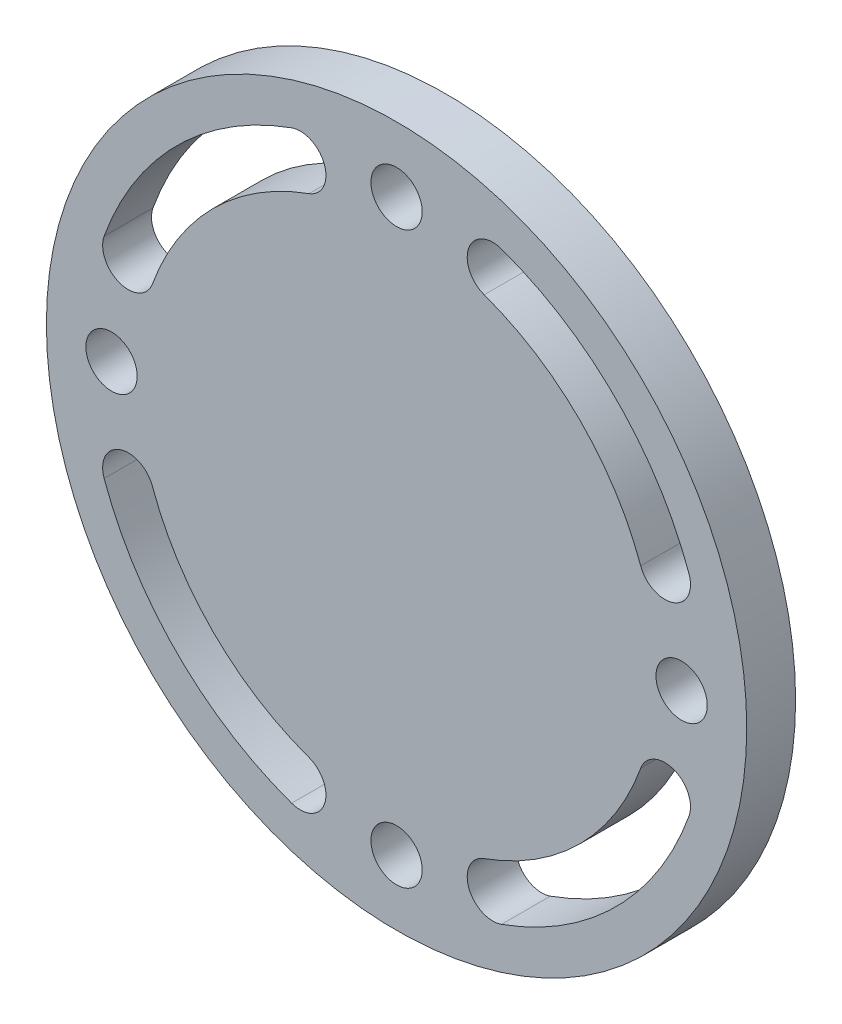
ISO-10303-21;
HEADER;
FILE_DESCRIPTION(('STEP AP214'),'2;1');
FILE_NAME('part.step','',(''),(''),'','','');
FILE_SCHEMA(('AUTOMOTIVE_DESIGN { 1 0 10303 214 1 1 1 1 }'));
ENDSEC;
DATA;
#1=APPLICATION_CONTEXT('core data for automotive mechanical design processes');
#2=APPLICATION_PROTOCOL_DEFINITION('international standard','automotive_design',2000,#1);
#3=PRODUCT_CONTEXT('',#1,'mechanical');
#4=PRODUCT('Part','Part','',(#3));
#5=PRODUCT_RELATED_PRODUCT_CATEGORY('part','',(#4));
#6=PRODUCT_DEFINITION_FORMATION('','',#4);
#7=PRODUCT_DEFINITION_CONTEXT('part definition',#1,'design');
#8=PRODUCT_DEFINITION('design','',#6,#7);
#9=PRODUCT_DEFINITION_SHAPE('','',#8);
#10=(LENGTH_UNIT() NAMED_UNIT(*) SI_UNIT(.MILLI.,.METRE.));
#11=(NAMED_UNIT(*) PLANE_ANGLE_UNIT() SI_UNIT($,.RADIAN.));
#12=(NAMED_UNIT(*) SI_UNIT($,.STERADIAN.) SOLID_ANGLE_UNIT());
#13=UNCERTAINTY_MEASURE_WITH_UNIT(LENGTH_MEASURE(1.E-05),#10,'distance_accuracy_value','');
#14=(GEOMETRIC_REPRESENTATION_CONTEXT(3) GLOBAL_UNCERTAINTY_ASSIGNED_CONTEXT((#13)) GLOBAL_UNIT_ASSIGNED_CONTEXT((#10,
#11,#12)) REPRESENTATION_CONTEXT('',''));
#15=CARTESIAN_POINT('',(0.,0.,0.));
#16=DIRECTION('',(0.,0.,1.));
#17=DIRECTION('',(1.,0.,0.));
#18=AXIS2_PLACEMENT_3D('',#15,#16,#17);
#19=CARTESIAN_POINT('',(0.,0.,3.));
#20=DIRECTION('',(0.,0.,1.));
#21=DIRECTION('',(1.,0.,0.));
#22=AXIS2_PLACEMENT_3D('',#19,#20,#21);
#23=PLANE('',#22);
#24=CARTESIAN_POINT('',(0.,-17.5,3.));
#25=DIRECTION('',(0.,0.,1.));
#26=DIRECTION('',(1.,0.,0.));
#27=AXIS2_PLACEMENT_3D('',#24,#25,#26);
#28=CIRCLE('',#27,1.575);
#29=CARTESIAN_POINT('',(1.57500000000001,-17.5,3.));
#30=VERTEX_POINT('',#29);
#31=EDGE_CURVE('E295',#30,#30,#28,.T.);
#32=ORIENTED_EDGE('',*,*,#31,.F.);
#33=EDGE_LOOP('',(#32));
#34=FACE_BOUND('',#33,.T.);
#35=CARTESIAN_POINT('',(-16.4714285714286,5.91117930842286,3.));
#36=DIRECTION('',(0.,0.,1.));
#37=DIRECTION('',(1.,0.,0.));
#38=AXIS2_PLACEMENT_3D('',#35,#36,#37);
#39=CIRCLE('',#38,1.575);
#40=CARTESIAN_POINT('',(-17.9538571428571,6.44318544618091,3.));
#41=VERTEX_POINT('',#40);
#42=CARTESIAN_POINT('',(-14.989,5.3791731706648,3.));
#43=VERTEX_POINT('',#42);
#44=EDGE_CURVE('E314',#41,#43,#39,.T.);
#45=ORIENTED_EDGE('',*,*,#44,.F.);
#46=CARTESIAN_POINT('',(0.,0.,3.));
#47=DIRECTION('',(0.,0.,1.));
#48=DIRECTION('',(1.,0.,0.));
#49=AXIS2_PLACEMENT_3D('',#46,#47,#48);
#50=CIRCLE('',#49,19.075);
#51=CARTESIAN_POINT('',(-6.44318544618092,17.9538571428571,3.));
#52=VERTEX_POINT('',#51);
#53=EDGE_CURVE('E311',#52,#41,#50,.T.);
#54=ORIENTED_EDGE('',*,*,#53,.F.);
#55=CARTESIAN_POINT('',(-5.91117930842286,16.4714285714286,3.));
#56=DIRECTION('',(0.,0.,1.));
#57=DIRECTION('',(1.,0.,0.));
#58=AXIS2_PLACEMENT_3D('',#55,#56,#57);
#59=CIRCLE('',#58,1.57500000000001);
#60=CARTESIAN_POINT('',(-5.3791731706648,14.989,3.));
#61=VERTEX_POINT('',#60);
#62=EDGE_CURVE('E322',#61,#52,#59,.T.);
#63=ORIENTED_EDGE('',*,*,#62,.F.);
#64=CARTESIAN_POINT('',(0.,0.,3.));
#65=DIRECTION('',(0.,0.,-1.));
#66=DIRECTION('',(1.,0.,0.));
#67=AXIS2_PLACEMENT_3D('',#64,#65,#66);
#68=CIRCLE('',#67,15.925);
#69=EDGE_CURVE('E318',#43,#61,#68,.T.);
#70=ORIENTED_EDGE('',*,*,#69,.F.);
#71=EDGE_LOOP('',(#45,#54,#63,#70));
#72=FACE_BOUND('',#71,.T.);
#73=CARTESIAN_POINT('',(0.,17.5,3.));
#74=DIRECTION('',(0.,0.,1.));
#75=DIRECTION('',(1.,0.,0.));
#76=AXIS2_PLACEMENT_3D('',#73,#74,#75);
#77=CIRCLE('',#76,1.575);
#78=CARTESIAN_POINT('',(1.575,17.5,3.));
#79=VERTEX_POINT('',#78);
#80=EDGE_CURVE('E354',#79,#79,#77,.T.);
#81=ORIENTED_EDGE('',*,*,#80,.F.);
#82=EDGE_LOOP('',(#81));
#83=FACE_BOUND('',#82,.T.);
#84=CARTESIAN_POINT('',(0.,0.,3.));
#85=DIRECTION('',(0.,0.,1.));
#86=DIRECTION('',(1.,0.,0.));
#87=AXIS2_PLACEMENT_3D('',#84,#85,#86);
#88=CIRCLE('',#87,21.5);
#89=CARTESIAN_POINT('',(21.5,0.,3.));
#90=VERTEX_POINT('',#89);
#91=EDGE_CURVE('E11',#90,#90,#88,.T.);
#92=ORIENTED_EDGE('',*,*,#91,.T.);
#93=EDGE_LOOP('',(#92));
#94=FACE_BOUND('',#93,.T.);
#95=CARTESIAN_POINT('',(17.5,0.,3.));
#96=DIRECTION('',(0.,0.,1.));
#97=DIRECTION('',(1.,0.,0.));
#98=AXIS2_PLACEMENT_3D('',#95,#96,#97);
#99=CIRCLE('',#98,1.575);
#100=CARTESIAN_POINT('',(19.075,0.,3.));
#101=VERTEX_POINT('',#100);
#102=EDGE_CURVE('E303',#101,#101,#99,.T.);
#103=ORIENTED_EDGE('',*,*,#102,.F.);
#104=EDGE_LOOP('',(#103));
#105=FACE_BOUND('',#104,.T.);
#106=CARTESIAN_POINT('',(-17.5,0.,3.));
#107=DIRECTION('',(0.,0.,1.));
#108=DIRECTION('',(1.,0.,0.));
#109=AXIS2_PLACEMENT_3D('',#106,#107,#108);
#110=CIRCLE('',#109,1.575);
#111=CARTESIAN_POINT('',(-15.925,0.,3.));
#112=VERTEX_POINT('',#111);
#113=EDGE_CURVE('E287',#112,#112,#110,.T.);
#114=ORIENTED_EDGE('',*,*,#113,.F.);
#115=EDGE_LOOP('',(#114));
#116=FACE_BOUND('',#115,.T.);
#117=CARTESIAN_POINT('',(0.,0.,3.));
#118=DIRECTION('',(0.,0.,-1.));
#119=DIRECTION('',(-1.,0.,0.));
#120=AXIS2_PLACEMENT_3D('',#117,#118,#119);
#121=CIRCLE('',#120,15.925);
#122=CARTESIAN_POINT('',(5.3791731706648,14.989,3.));
#123=VERTEX_POINT('',#122);
#124=CARTESIAN_POINT('',(14.989,5.3791731706648,3.));
#125=VERTEX_POINT('',#124);
#126=EDGE_CURVE('E247',#123,#125,#121,.T.);
#127=ORIENTED_EDGE('',*,*,#126,.F.);
#128=CARTESIAN_POINT('',(5.91117930842286,16.4714285714286,3.));
#129=DIRECTION('',(0.,0.,1.));
#130=DIRECTION('',(-1.,0.,0.));
#131=AXIS2_PLACEMENT_3D('',#128,#129,#130);
#132=CIRCLE('',#131,1.57500000000001);
#133=CARTESIAN_POINT('',(6.44318544618091,17.9538571428571,3.));
#134=VERTEX_POINT('',#133);
#135=EDGE_CURVE('E244',#134,#123,#132,.T.);
#136=ORIENTED_EDGE('',*,*,#135,.F.);
#137=CARTESIAN_POINT('',(0.,0.,3.));
#138=DIRECTION('',(0.,0.,1.));
#139=DIRECTION('',(-1.,0.,0.));
#140=AXIS2_PLACEMENT_3D('',#137,#138,#139);
#141=CIRCLE('',#140,19.075);
#142=CARTESIAN_POINT('',(17.9538571428571,6.44318544618092,3.));
#143=VERTEX_POINT('',#142);
#144=EDGE_CURVE('E255',#143,#134,#141,.T.);
#145=ORIENTED_EDGE('',*,*,#144,.F.);
#146=CARTESIAN_POINT('',(16.4714285714286,5.91117930842286,3.));
#147=DIRECTION('',(0.,0.,1.));
#148=DIRECTION('',(-1.,0.,0.));
#149=AXIS2_PLACEMENT_3D('',#146,#147,#148);
#150=CIRCLE('',#149,1.575);
#151=EDGE_CURVE('E251',#125,#143,#150,.T.);
#152=ORIENTED_EDGE('',*,*,#151,.F.);
#153=EDGE_LOOP('',(#127,#136,#145,#152));
#154=FACE_BOUND('',#153,.T.);
#155=CARTESIAN_POINT('',(5.91117930842286,-16.4714285714286,3.));
#156=DIRECTION('',(0.,0.,1.));
#157=DIRECTION('',(1.,0.,0.));
#158=AXIS2_PLACEMENT_3D('',#155,#156,#157);
#159=CIRCLE('',#158,1.57500000000001);
#160=CARTESIAN_POINT('',(5.3791731706648,-14.989,3.));
#161=VERTEX_POINT('',#160);
#162=CARTESIAN_POINT('',(6.44318544618092,-17.9538571428571,3.));
#163=VERTEX_POINT('',#162);
#164=EDGE_CURVE('E204',#161,#163,#159,.T.);
#165=ORIENTED_EDGE('',*,*,#164,.F.);
#166=CARTESIAN_POINT('',(0.,0.,3.));
#167=DIRECTION('',(0.,0.,-1.));
#168=DIRECTION('',(1.,0.,0.));
#169=AXIS2_PLACEMENT_3D('',#166,#167,#168);
#170=CIRCLE('',#169,15.925);
#171=CARTESIAN_POINT('',(14.989,-5.3791731706648,3.));
#172=VERTEX_POINT('',#171);
#173=EDGE_CURVE('E201',#172,#161,#170,.T.);
#174=ORIENTED_EDGE('',*,*,#173,.F.);
#175=CARTESIAN_POINT('',(16.4714285714286,-5.91117930842286,3.));
#176=DIRECTION('',(0.,0.,1.));
#177=DIRECTION('',(1.,0.,0.));
#178=AXIS2_PLACEMENT_3D('',#175,#176,#177);
#179=CIRCLE('',#178,1.575);
#180=CARTESIAN_POINT('',(17.9538571428571,-6.44318544618092,3.));
#181=VERTEX_POINT('',#180);
#182=EDGE_CURVE('E212',#181,#172,#179,.T.);
#183=ORIENTED_EDGE('',*,*,#182,.F.);
#184=CARTESIAN_POINT('',(0.,0.,3.));
#185=DIRECTION('',(0.,0.,1.));
#186=DIRECTION('',(1.,0.,0.));
#187=AXIS2_PLACEMENT_3D('',#184,#185,#186);
#188=CIRCLE('',#187,19.075);
#189=EDGE_CURVE('E208',#163,#181,#188,.T.);
#190=ORIENTED_EDGE('',*,*,#189,.F.);
#191=EDGE_LOOP('',(#165,#174,#183,#190));
#192=FACE_BOUND('',#191,.T.);
#193=CARTESIAN_POINT('',(0.,0.,3.));
#194=DIRECTION('',(0.,0.,-1.));
#195=DIRECTION('',(-1.,0.,0.));
#196=AXIS2_PLACEMENT_3D('',#193,#194,#195);
#197=CIRCLE('',#196,15.925);
#198=CARTESIAN_POINT('',(-5.3791731706648,-14.989,3.));
#199=VERTEX_POINT('',#198);
#200=CARTESIAN_POINT('',(-14.989,-5.3791731706648,3.));
#201=VERTEX_POINT('',#200);
#202=EDGE_CURVE('E162',#199,#201,#197,.T.);
#203=ORIENTED_EDGE('',*,*,#202,.F.);
#204=CARTESIAN_POINT('',(-5.91117930842286,-16.4714285714286,3.));
#205=DIRECTION('',(0.,0.,1.));
#206=DIRECTION('',(-1.,0.,0.));
#207=AXIS2_PLACEMENT_3D('',#204,#205,#206);
#208=CIRCLE('',#207,1.57500000000001);
#209=CARTESIAN_POINT('',(-6.44318544618092,-17.9538571428571,3.));
#210=VERTEX_POINT('',#209);
#211=EDGE_CURVE('E153',#210,#199,#208,.T.);
#212=ORIENTED_EDGE('',*,*,#211,.F.);
#213=CARTESIAN_POINT('',(0.,0.,3.));
#214=DIRECTION('',(0.,0.,1.));
#215=DIRECTION('',(-1.,0.,0.));
#216=AXIS2_PLACEMENT_3D('',#213,#214,#215);
#217=CIRCLE('',#216,19.075);
#218=CARTESIAN_POINT('',(-17.9538571428571,-6.44318544618092,3.));
#219=VERTEX_POINT('',#218);
#220=EDGE_CURVE('E179',#219,#210,#217,.T.);
#221=ORIENTED_EDGE('',*,*,#220,.F.);
#222=CARTESIAN_POINT('',(-16.4714285714286,-5.91117930842286,3.));
#223=DIRECTION('',(0.,0.,1.));
#224=DIRECTION('',(-1.,0.,0.));
#225=AXIS2_PLACEMENT_3D('',#222,#223,#224);
#226=CIRCLE('',#225,1.575);
#227=EDGE_CURVE('E175',#201,#219,#226,.T.);
#228=ORIENTED_EDGE('',*,*,#227,.F.);
#229=EDGE_LOOP('',(#203,#212,#221,#228));
#230=FACE_BOUND('',#229,.T.);
#231=ADVANCED_FACE('F39',(#34,#72,#83,#94,#105,#116,#154,#192,#230),#23,.T.);
#232=CARTESIAN_POINT('',(0.,0.,0.));
#233=DIRECTION('',(0.,0.,1.));
#234=DIRECTION('',(1.,0.,0.));
#235=AXIS2_PLACEMENT_3D('',#232,#233,#234);
#236=PLANE('',#235);
#237=CARTESIAN_POINT('',(0.,0.,0.));
#238=DIRECTION('',(0.,0.,-1.));
#239=DIRECTION('',(1.,0.,0.));
#240=AXIS2_PLACEMENT_3D('',#237,#238,#239);
#241=CIRCLE('',#240,15.925);
#242=CARTESIAN_POINT('',(14.989,-5.3791731706648,0.));
#243=VERTEX_POINT('',#242);
#244=CARTESIAN_POINT('',(5.3791731706648,-14.989,0.));
#245=VERTEX_POINT('',#244);
#246=EDGE_CURVE('E171',#243,#245,#241,.T.);
#247=ORIENTED_EDGE('',*,*,#246,.T.);
#248=CARTESIAN_POINT('',(5.91117930842286,-16.4714285714286,0.));
#249=DIRECTION('',(0.,0.,1.));
#250=DIRECTION('',(1.,0.,0.));
#251=AXIS2_PLACEMENT_3D('',#248,#249,#250);
#252=CIRCLE('',#251,1.57500000000001);
#253=CARTESIAN_POINT('',(6.44318544618092,-17.9538571428571,0.));
#254=VERTEX_POINT('',#253);
#255=EDGE_CURVE('E219',#245,#254,#252,.T.);
#256=ORIENTED_EDGE('',*,*,#255,.T.);
#257=CARTESIAN_POINT('',(0.,0.,0.));
#258=DIRECTION('',(0.,0.,1.));
#259=DIRECTION('',(1.,0.,0.));
#260=AXIS2_PLACEMENT_3D('',#257,#258,#259);
#261=CIRCLE('',#260,19.075);
#262=CARTESIAN_POINT('',(17.9538571428571,-6.44318544618092,0.));
#263=VERTEX_POINT('',#262);
#264=EDGE_CURVE('E223',#254,#263,#261,.T.);
#265=ORIENTED_EDGE('',*,*,#264,.T.);
#266=CARTESIAN_POINT('',(16.4714285714286,-5.91117930842286,0.));
#267=DIRECTION('',(0.,0.,1.));
#268=DIRECTION('',(1.,0.,0.));
#269=AXIS2_PLACEMENT_3D('',#266,#267,#268);
#270=CIRCLE('',#269,1.575);
#271=EDGE_CURVE('E205',#263,#243,#270,.T.);
#272=ORIENTED_EDGE('',*,*,#271,.T.);
#273=EDGE_LOOP('',(#247,#256,#265,#272));
#274=FACE_BOUND('',#273,.T.);
#275=CARTESIAN_POINT('',(-17.5,0.,0.));
#276=DIRECTION('',(0.,0.,1.));
#277=DIRECTION('',(1.,0.,0.));
#278=AXIS2_PLACEMENT_3D('',#275,#276,#277);
#279=CIRCLE('',#278,1.575);
#280=CARTESIAN_POINT('',(-15.925,0.,0.));
#281=VERTEX_POINT('',#280);
#282=EDGE_CURVE('E286',#281,#281,#279,.T.);
#283=ORIENTED_EDGE('',*,*,#282,.T.);
#284=EDGE_LOOP('',(#283));
#285=FACE_BOUND('',#284,.T.);
#286=CARTESIAN_POINT('',(0.,-17.5,0.));
#287=DIRECTION('',(0.,0.,1.));
#288=DIRECTION('',(1.,0.,0.));
#289=AXIS2_PLACEMENT_3D('',#286,#287,#288);
#290=CIRCLE('',#289,1.575);
#291=CARTESIAN_POINT('',(1.57500000000001,-17.5,0.));
#292=VERTEX_POINT('',#291);
#293=EDGE_CURVE('E291',#292,#292,#290,.T.);
#294=ORIENTED_EDGE('',*,*,#293,.T.);
#295=EDGE_LOOP('',(#294));
#296=FACE_BOUND('',#295,.T.);
#297=CARTESIAN_POINT('',(17.5,0.,0.));
#298=DIRECTION('',(0.,0.,1.));
#299=DIRECTION('',(1.,0.,0.));
#300=AXIS2_PLACEMENT_3D('',#297,#298,#299);
#301=CIRCLE('',#300,1.575);
#302=CARTESIAN_POINT('',(19.075,0.,0.));
#303=VERTEX_POINT('',#302);
#304=EDGE_CURVE('E299',#303,#303,#301,.T.);
#305=ORIENTED_EDGE('',*,*,#304,.T.);
#306=EDGE_LOOP('',(#305));
#307=FACE_BOUND('',#306,.T.);
#308=CARTESIAN_POINT('',(0.,0.,0.));
#309=DIRECTION('',(0.,0.,1.));
#310=DIRECTION('',(1.,0.,0.));
#311=AXIS2_PLACEMENT_3D('',#308,#309,#310);
#312=CIRCLE('',#311,19.075);
#313=CARTESIAN_POINT('',(-6.44318544618092,17.9538571428571,0.));
#314=VERTEX_POINT('',#313);
#315=CARTESIAN_POINT('',(-17.9538571428571,6.44318544618091,0.));
#316=VERTEX_POINT('',#315);
#317=EDGE_CURVE('E307',#314,#316,#312,.T.);
#318=ORIENTED_EDGE('',*,*,#317,.T.);
#319=CARTESIAN_POINT('',(-16.4714285714286,5.91117930842286,0.));
#320=DIRECTION('',(0.,0.,1.));
#321=DIRECTION('',(1.,0.,0.));
#322=AXIS2_PLACEMENT_3D('',#319,#320,#321);
#323=CIRCLE('',#322,1.575);
#324=CARTESIAN_POINT('',(-14.989,5.3791731706648,0.));
#325=VERTEX_POINT('',#324);
#326=EDGE_CURVE('E329',#316,#325,#323,.T.);
#327=ORIENTED_EDGE('',*,*,#326,.T.);
#328=CARTESIAN_POINT('',(0.,0.,0.));
#329=DIRECTION('',(0.,0.,-1.));
#330=DIRECTION('',(1.,0.,0.));
#331=AXIS2_PLACEMENT_3D('',#328,#329,#330);
#332=CIRCLE('',#331,15.925);
#333=CARTESIAN_POINT('',(-5.3791731706648,14.989,0.));
#334=VERTEX_POINT('',#333);
#335=EDGE_CURVE('E333',#325,#334,#332,.T.);
#336=ORIENTED_EDGE('',*,*,#335,.T.);
#337=CARTESIAN_POINT('',(-5.91117930842286,16.4714285714286,0.));
#338=DIRECTION('',(0.,0.,1.));
#339=DIRECTION('',(1.,0.,0.));
#340=AXIS2_PLACEMENT_3D('',#337,#338,#339);
#341=CIRCLE('',#340,1.57500000000001);
#342=EDGE_CURVE('E315',#334,#314,#341,.T.);
#343=ORIENTED_EDGE('',*,*,#342,.T.);
#344=EDGE_LOOP('',(#318,#327,#336,#343));
#345=FACE_BOUND('',#344,.T.);
#346=CARTESIAN_POINT('',(0.,0.,0.));
#347=DIRECTION('',(0.,0.,1.));
#348=DIRECTION('',(1.,0.,0.));
#349=AXIS2_PLACEMENT_3D('',#346,#347,#348);
#350=CIRCLE('',#349,21.5);
#351=CARTESIAN_POINT('',(21.5,0.,0.));
#352=VERTEX_POINT('',#351);
#353=EDGE_CURVE('E43',#352,#352,#350,.T.);
#354=ORIENTED_EDGE('',*,*,#353,.F.);
#355=EDGE_LOOP('',(#354));
#356=FACE_BOUND('',#355,.T.);
#357=CARTESIAN_POINT('',(0.,17.5,0.));
#358=DIRECTION('',(0.,0.,1.));
#359=DIRECTION('',(1.,0.,0.));
#360=AXIS2_PLACEMENT_3D('',#357,#358,#359);
#361=CIRCLE('',#360,1.575);
#362=CARTESIAN_POINT('',(1.575,17.5,0.));
#363=VERTEX_POINT('',#362);
#364=EDGE_CURVE('E353',#363,#363,#361,.T.);
#365=ORIENTED_EDGE('',*,*,#364,.T.);
#366=EDGE_LOOP('',(#365));
#367=FACE_BOUND('',#366,.T.);
#368=CARTESIAN_POINT('',(5.91117930842286,16.4714285714286,0.));
#369=DIRECTION('',(0.,0.,1.));
#370=DIRECTION('',(-1.,0.,0.));
#371=AXIS2_PLACEMENT_3D('',#368,#369,#370);
#372=CIRCLE('',#371,1.57500000000001);
#373=CARTESIAN_POINT('',(6.44318544618091,17.9538571428571,0.));
#374=VERTEX_POINT('',#373);
#375=CARTESIAN_POINT('',(5.3791731706648,14.989,0.));
#376=VERTEX_POINT('',#375);
#377=EDGE_CURVE('E243',#374,#376,#372,.T.);
#378=ORIENTED_EDGE('',*,*,#377,.T.);
#379=CARTESIAN_POINT('',(0.,0.,0.));
#380=DIRECTION('',(0.,0.,-1.));
#381=DIRECTION('',(-1.,0.,0.));
#382=AXIS2_PLACEMENT_3D('',#379,#380,#381);
#383=CIRCLE('',#382,15.925);
#384=CARTESIAN_POINT('',(14.989,5.3791731706648,0.));
#385=VERTEX_POINT('',#384);
#386=EDGE_CURVE('E262',#376,#385,#383,.T.);
#387=ORIENTED_EDGE('',*,*,#386,.T.);
#388=CARTESIAN_POINT('',(16.4714285714286,5.91117930842286,0.));
#389=DIRECTION('',(0.,0.,1.));
#390=DIRECTION('',(-1.,0.,0.));
#391=AXIS2_PLACEMENT_3D('',#388,#389,#390);
#392=CIRCLE('',#391,1.575);
#393=CARTESIAN_POINT('',(17.9538571428571,6.44318544618091,0.));
#394=VERTEX_POINT('',#393);
#395=EDGE_CURVE('E266',#385,#394,#392,.T.);
#396=ORIENTED_EDGE('',*,*,#395,.T.);
#397=CARTESIAN_POINT('',(0.,0.,0.));
#398=DIRECTION('',(0.,0.,1.));
#399=DIRECTION('',(-1.,0.,0.));
#400=AXIS2_PLACEMENT_3D('',#397,#398,#399);
#401=CIRCLE('',#400,19.075);
#402=EDGE_CURVE('E248',#394,#374,#401,.T.);
#403=ORIENTED_EDGE('',*,*,#402,.T.);
#404=EDGE_LOOP('',(#378,#387,#396,#403));
#405=FACE_BOUND('',#404,.T.);
#406=CARTESIAN_POINT('',(-5.91117930842286,-16.4714285714286,0.));
#407=DIRECTION('',(0.,0.,1.));
#408=DIRECTION('',(-1.,0.,0.));
#409=AXIS2_PLACEMENT_3D('',#406,#407,#408);
#410=CIRCLE('',#409,1.57500000000001);
#411=CARTESIAN_POINT('',(-6.44318544618092,-17.9538571428571,0.));
#412=VERTEX_POINT('',#411);
#413=CARTESIAN_POINT('',(-5.3791731706648,-14.989,0.));
#414=VERTEX_POINT('',#413);
#415=EDGE_CURVE('E63',#412,#414,#410,.T.);
#416=ORIENTED_EDGE('',*,*,#415,.T.);
#417=CARTESIAN_POINT('',(0.,0.,0.));
#418=DIRECTION('',(0.,0.,-1.));
#419=DIRECTION('',(-1.,0.,0.));
#420=AXIS2_PLACEMENT_3D('',#417,#418,#419);
#421=CIRCLE('',#420,15.925);
#422=CARTESIAN_POINT('',(-14.989,-5.3791731706648,0.));
#423=VERTEX_POINT('',#422);
#424=EDGE_CURVE('E169',#414,#423,#421,.T.);
#425=ORIENTED_EDGE('',*,*,#424,.T.);
#426=CARTESIAN_POINT('',(-16.4714285714286,-5.91117930842286,0.));
#427=DIRECTION('',(0.,0.,1.));
#428=DIRECTION('',(-1.,0.,0.));
#429=AXIS2_PLACEMENT_3D('',#426,#427,#428);
#430=CIRCLE('',#429,1.575);
#431=CARTESIAN_POINT('',(-17.9538571428571,-6.44318544618091,0.));
#432=VERTEX_POINT('',#431);
#433=EDGE_CURVE('E188',#423,#432,#430,.T.);
#434=ORIENTED_EDGE('',*,*,#433,.T.);
#435=CARTESIAN_POINT('',(0.,0.,0.));
#436=DIRECTION('',(0.,0.,1.));
#437=DIRECTION('',(-1.,0.,0.));
#438=AXIS2_PLACEMENT_3D('',#435,#436,#437);
#439=CIRCLE('',#438,19.075);
#440=EDGE_CURVE('E163',#432,#412,#439,.T.);
#441=ORIENTED_EDGE('',*,*,#440,.T.);
#442=EDGE_LOOP('',(#416,#425,#434,#441));
#443=FACE_BOUND('',#442,.T.);
#444=ADVANCED_FACE('F362',(#274,#285,#296,#307,#345,#356,#367,#405,#443),#236,.F.);
#445=CARTESIAN_POINT('',(0.,0.,3.));
#446=DIRECTION('',(0.,0.,-1.));
#447=DIRECTION('',(-1.,0.,0.));
#448=AXIS2_PLACEMENT_3D('',#445,#446,#447);
#449=CYLINDRICAL_SURFACE('',#448,21.5);
#450=ORIENTED_EDGE('',*,*,#91,.F.);
#451=EDGE_LOOP('',(#450));
#452=FACE_BOUND('',#451,.T.);
#453=ORIENTED_EDGE('',*,*,#353,.T.);
#454=EDGE_LOOP('',(#453));
#455=FACE_BOUND('',#454,.T.);
#456=ADVANCED_FACE('F41',(#452,#455),#449,.T.);
#457=CARTESIAN_POINT('',(0.,17.5,3.));
#458=DIRECTION('',(0.,0.,-1.));
#459=DIRECTION('',(-1.,0.,0.));
#460=AXIS2_PLACEMENT_3D('',#457,#458,#459);
#461=CYLINDRICAL_SURFACE('',#460,1.575);
#462=ORIENTED_EDGE('',*,*,#80,.T.);
#463=EDGE_LOOP('',(#462));
#464=FACE_BOUND('',#463,.T.);
#465=ORIENTED_EDGE('',*,*,#364,.F.);
#466=EDGE_LOOP('',(#465));
#467=FACE_BOUND('',#466,.T.);
#468=ADVANCED_FACE('F365',(#464,#467),#461,.F.);
#469=CARTESIAN_POINT('',(0.,0.,3.));
#470=DIRECTION('',(0.,0.,-1.));
#471=DIRECTION('',(-1.,0.,0.));
#472=AXIS2_PLACEMENT_3D('',#469,#470,#471);
#473=CYLINDRICAL_SURFACE('',#472,19.075);
#474=ORIENTED_EDGE('',*,*,#317,.F.);
#475=DIRECTION('',(0.,0.,-1.));
#476=VECTOR('',#475,1.);
#477=CARTESIAN_POINT('',(-6.44318544618092,17.9538571428571,3.));
#478=LINE('',#477,#476);
#479=EDGE_CURVE('E325',#52,#314,#478,.T.);
#480=ORIENTED_EDGE('',*,*,#479,.F.);
#481=ORIENTED_EDGE('',*,*,#53,.T.);
#482=DIRECTION('',(0.,0.,-1.));
#483=VECTOR('',#482,1.);
#484=CARTESIAN_POINT('',(-17.9538571428571,6.44318544618091,3.));
#485=LINE('',#484,#483);
#486=EDGE_CURVE('E349',#41,#316,#485,.T.);
#487=ORIENTED_EDGE('',*,*,#486,.T.);
#488=EDGE_LOOP('',(#474,#480,#481,#487));
#489=FACE_BOUND('',#488,.T.);
#490=ADVANCED_FACE('F367',(#489),#473,.F.);
#491=CARTESIAN_POINT('',(-16.4714285714286,5.91117930842286,3.));
#492=DIRECTION('',(0.,0.,-1.));
#493=DIRECTION('',(-1.,0.,0.));
#494=AXIS2_PLACEMENT_3D('',#491,#492,#493);
#495=CYLINDRICAL_SURFACE('',#494,1.575);
#496=ORIENTED_EDGE('',*,*,#326,.F.);
#497=ORIENTED_EDGE('',*,*,#486,.F.);
#498=ORIENTED_EDGE('',*,*,#44,.T.);
#499=DIRECTION('',(0.,0.,-1.));
#500=VECTOR('',#499,1.);
#501=CARTESIAN_POINT('',(-14.989,5.3791731706648,3.));
#502=LINE('',#501,#500);
#503=EDGE_CURVE('E346',#43,#325,#502,.T.);
#504=ORIENTED_EDGE('',*,*,#503,.T.);
#505=EDGE_LOOP('',(#496,#497,#498,#504));
#506=FACE_BOUND('',#505,.T.);
#507=ADVANCED_FACE('F374',(#506),#495,.F.);
#508=CARTESIAN_POINT('',(0.,0.,3.));
#509=DIRECTION('',(0.,0.,-1.));
#510=DIRECTION('',(-1.,0.,0.));
#511=AXIS2_PLACEMENT_3D('',#508,#509,#510);
#512=CYLINDRICAL_SURFACE('',#511,15.925);
#513=ORIENTED_EDGE('',*,*,#335,.F.);
#514=ORIENTED_EDGE('',*,*,#503,.F.);
#515=ORIENTED_EDGE('',*,*,#69,.T.);
#516=DIRECTION('',(0.,0.,-1.));
#517=VECTOR('',#516,1.);
#518=CARTESIAN_POINT('',(-5.3791731706648,14.989,3.));
#519=LINE('',#518,#517);
#520=EDGE_CURVE('E343',#61,#334,#519,.T.);
#521=ORIENTED_EDGE('',*,*,#520,.T.);
#522=EDGE_LOOP('',(#513,#514,#515,#521));
#523=FACE_BOUND('',#522,.T.);
#524=ADVANCED_FACE('F466',(#523),#512,.T.);
#525=CARTESIAN_POINT('',(-5.91117930842286,16.4714285714286,3.));
#526=DIRECTION('',(0.,0.,-1.));
#527=DIRECTION('',(-1.,0.,0.));
#528=AXIS2_PLACEMENT_3D('',#525,#526,#527);
#529=CYLINDRICAL_SURFACE('',#528,1.57500000000001);
#530=ORIENTED_EDGE('',*,*,#342,.F.);
#531=ORIENTED_EDGE('',*,*,#520,.F.);
#532=ORIENTED_EDGE('',*,*,#62,.T.);
#533=ORIENTED_EDGE('',*,*,#479,.T.);
#534=EDGE_LOOP('',(#530,#531,#532,#533));
#535=FACE_BOUND('',#534,.T.);
#536=ADVANCED_FACE('F462',(#535),#529,.F.);
#537=CARTESIAN_POINT('',(17.5,0.,3.));
#538=DIRECTION('',(0.,0.,-1.));
#539=DIRECTION('',(-1.,0.,0.));
#540=AXIS2_PLACEMENT_3D('',#537,#538,#539);
#541=CYLINDRICAL_SURFACE('',#540,1.575);
#542=ORIENTED_EDGE('',*,*,#102,.T.);
#543=EDGE_LOOP('',(#542));
#544=FACE_BOUND('',#543,.T.);
#545=ORIENTED_EDGE('',*,*,#304,.F.);
#546=EDGE_LOOP('',(#545));
#547=FACE_BOUND('',#546,.T.);
#548=ADVANCED_FACE('F458',(#544,#547),#541,.F.);
#549=CARTESIAN_POINT('',(0.,-17.5,3.));
#550=DIRECTION('',(0.,0.,-1.));
#551=DIRECTION('',(-1.,0.,0.));
#552=AXIS2_PLACEMENT_3D('',#549,#550,#551);
#553=CYLINDRICAL_SURFACE('',#552,1.575);
#554=ORIENTED_EDGE('',*,*,#31,.T.);
#555=EDGE_LOOP('',(#554));
#556=FACE_BOUND('',#555,.T.);
#557=ORIENTED_EDGE('',*,*,#293,.F.);
#558=EDGE_LOOP('',(#557));
#559=FACE_BOUND('',#558,.T.);
#560=ADVANCED_FACE('F454',(#556,#559),#553,.F.);
#561=CARTESIAN_POINT('',(-17.5,0.,3.));
#562=DIRECTION('',(0.,0.,-1.));
#563=DIRECTION('',(-1.,0.,0.));
#564=AXIS2_PLACEMENT_3D('',#561,#562,#563);
#565=CYLINDRICAL_SURFACE('',#564,1.575);
#566=ORIENTED_EDGE('',*,*,#113,.T.);
#567=EDGE_LOOP('',(#566));
#568=FACE_BOUND('',#567,.T.);
#569=ORIENTED_EDGE('',*,*,#282,.F.);
#570=EDGE_LOOP('',(#569));
#571=FACE_BOUND('',#570,.T.);
#572=ADVANCED_FACE('F450',(#568,#571),#565,.F.);
#573=CARTESIAN_POINT('',(5.91117930842286,16.4714285714286,3.));
#574=DIRECTION('',(0.,0.,-1.));
#575=DIRECTION('',(-1.,0.,0.));
#576=AXIS2_PLACEMENT_3D('',#573,#574,#575);
#577=CYLINDRICAL_SURFACE('',#576,1.57500000000001);
#578=ORIENTED_EDGE('',*,*,#377,.F.);
#579=DIRECTION('',(0.,0.,-1.));
#580=VECTOR('',#579,1.);
#581=CARTESIAN_POINT('',(6.44318544618091,17.9538571428571,3.));
#582=LINE('',#581,#580);
#583=EDGE_CURVE('E258',#134,#374,#582,.T.);
#584=ORIENTED_EDGE('',*,*,#583,.F.);
#585=ORIENTED_EDGE('',*,*,#135,.T.);
#586=DIRECTION('',(0.,0.,-1.));
#587=VECTOR('',#586,1.);
#588=CARTESIAN_POINT('',(5.3791731706648,14.989,3.));
#589=LINE('',#588,#587);
#590=EDGE_CURVE('E282',#123,#376,#589,.T.);
#591=ORIENTED_EDGE('',*,*,#590,.T.);
#592=EDGE_LOOP('',(#578,#584,#585,#591));
#593=FACE_BOUND('',#592,.T.);
#594=ADVANCED_FACE('F446',(#593),#577,.F.);
#595=CARTESIAN_POINT('',(0.,0.,3.));
#596=DIRECTION('',(0.,0.,-1.));
#597=DIRECTION('',(-1.,0.,0.));
#598=AXIS2_PLACEMENT_3D('',#595,#596,#597);
#599=CYLINDRICAL_SURFACE('',#598,15.925);
#600=ORIENTED_EDGE('',*,*,#386,.F.);
#601=ORIENTED_EDGE('',*,*,#590,.F.);
#602=ORIENTED_EDGE('',*,*,#126,.T.);
#603=DIRECTION('',(0.,0.,-1.));
#604=VECTOR('',#603,1.);
#605=CARTESIAN_POINT('',(14.989,5.3791731706648,3.));
#606=LINE('',#605,#604);
#607=EDGE_CURVE('E279',#125,#385,#606,.T.);
#608=ORIENTED_EDGE('',*,*,#607,.T.);
#609=EDGE_LOOP('',(#600,#601,#602,#608));
#610=FACE_BOUND('',#609,.T.);
#611=ADVANCED_FACE('F442',(#610),#599,.T.);
#612=CARTESIAN_POINT('',(16.4714285714286,5.91117930842286,3.));
#613=DIRECTION('',(0.,0.,-1.));
#614=DIRECTION('',(-1.,0.,0.));
#615=AXIS2_PLACEMENT_3D('',#612,#613,#614);
#616=CYLINDRICAL_SURFACE('',#615,1.575);
#617=ORIENTED_EDGE('',*,*,#395,.F.);
#618=ORIENTED_EDGE('',*,*,#607,.F.);
#619=ORIENTED_EDGE('',*,*,#151,.T.);
#620=DIRECTION('',(0.,0.,-1.));
#621=VECTOR('',#620,1.);
#622=CARTESIAN_POINT('',(17.9538571428571,6.44318544618091,3.));
#623=LINE('',#622,#621);
#624=EDGE_CURVE('E276',#143,#394,#623,.T.);
#625=ORIENTED_EDGE('',*,*,#624,.T.);
#626=EDGE_LOOP('',(#617,#618,#619,#625));
#627=FACE_BOUND('',#626,.T.);
#628=ADVANCED_FACE('F438',(#627),#616,.F.);
#629=CARTESIAN_POINT('',(0.,0.,3.));
#630=DIRECTION('',(0.,0.,-1.));
#631=DIRECTION('',(-1.,0.,0.));
#632=AXIS2_PLACEMENT_3D('',#629,#630,#631);
#633=CYLINDRICAL_SURFACE('',#632,19.075);
#634=ORIENTED_EDGE('',*,*,#402,.F.);
#635=ORIENTED_EDGE('',*,*,#624,.F.);
#636=ORIENTED_EDGE('',*,*,#144,.T.);
#637=ORIENTED_EDGE('',*,*,#583,.T.);
#638=EDGE_LOOP('',(#634,#635,#636,#637));
#639=FACE_BOUND('',#638,.T.);
#640=ADVANCED_FACE('F435',(#639),#633,.F.);
#641=CARTESIAN_POINT('',(0.,0.,3.));
#642=DIRECTION('',(0.,0.,-1.));
#643=DIRECTION('',(-1.,0.,0.));
#644=AXIS2_PLACEMENT_3D('',#641,#642,#643);
#645=CYLINDRICAL_SURFACE('',#644,15.925);
#646=ORIENTED_EDGE('',*,*,#246,.F.);
#647=DIRECTION('',(0.,0.,-1.));
#648=VECTOR('',#647,1.);
#649=CARTESIAN_POINT('',(14.989,-5.3791731706648,3.));
#650=LINE('',#649,#648);
#651=EDGE_CURVE('E215',#172,#243,#650,.T.);
#652=ORIENTED_EDGE('',*,*,#651,.F.);
#653=ORIENTED_EDGE('',*,*,#173,.T.);
#654=DIRECTION('',(0.,0.,-1.));
#655=VECTOR('',#654,1.);
#656=CARTESIAN_POINT('',(5.3791731706648,-14.989,3.));
#657=LINE('',#656,#655);
#658=EDGE_CURVE('E239',#161,#245,#657,.T.);
#659=ORIENTED_EDGE('',*,*,#658,.T.);
#660=EDGE_LOOP('',(#646,#652,#653,#659));
#661=FACE_BOUND('',#660,.T.);
#662=ADVANCED_FACE('F417',(#661),#645,.T.);
#663=CARTESIAN_POINT('',(5.91117930842286,-16.4714285714286,3.));
#664=DIRECTION('',(0.,0.,-1.));
#665=DIRECTION('',(-1.,0.,0.));
#666=AXIS2_PLACEMENT_3D('',#663,#664,#665);
#667=CYLINDRICAL_SURFACE('',#666,1.57500000000001);
#668=ORIENTED_EDGE('',*,*,#255,.F.);
#669=ORIENTED_EDGE('',*,*,#658,.F.);
#670=ORIENTED_EDGE('',*,*,#164,.T.);
#671=DIRECTION('',(0.,0.,-1.));
#672=VECTOR('',#671,1.);
#673=CARTESIAN_POINT('',(6.44318544618092,-17.9538571428571,3.));
#674=LINE('',#673,#672);
#675=EDGE_CURVE('E236',#163,#254,#674,.T.);
#676=ORIENTED_EDGE('',*,*,#675,.T.);
#677=EDGE_LOOP('',(#668,#669,#670,#676));
#678=FACE_BOUND('',#677,.T.);
#679=ADVANCED_FACE('F410',(#678),#667,.F.);
#680=CARTESIAN_POINT('',(0.,0.,3.));
#681=DIRECTION('',(0.,0.,-1.));
#682=DIRECTION('',(-1.,0.,0.));
#683=AXIS2_PLACEMENT_3D('',#680,#681,#682);
#684=CYLINDRICAL_SURFACE('',#683,19.075);
#685=ORIENTED_EDGE('',*,*,#264,.F.);
#686=ORIENTED_EDGE('',*,*,#675,.F.);
#687=ORIENTED_EDGE('',*,*,#189,.T.);
#688=DIRECTION('',(0.,0.,-1.));
#689=VECTOR('',#688,1.);
#690=CARTESIAN_POINT('',(17.9538571428571,-6.44318544618092,3.));
#691=LINE('',#690,#689);
#692=EDGE_CURVE('E233',#181,#263,#691,.T.);
#693=ORIENTED_EDGE('',*,*,#692,.T.);
#694=EDGE_LOOP('',(#685,#686,#687,#693));
#695=FACE_BOUND('',#694,.T.);
#696=ADVANCED_FACE('F413',(#695),#684,.F.);
#697=CARTESIAN_POINT('',(16.4714285714286,-5.91117930842286,3.));
#698=DIRECTION('',(0.,0.,-1.));
#699=DIRECTION('',(-1.,0.,0.));
#700=AXIS2_PLACEMENT_3D('',#697,#698,#699);
#701=CYLINDRICAL_SURFACE('',#700,1.575);
#702=ORIENTED_EDGE('',*,*,#271,.F.);
#703=ORIENTED_EDGE('',*,*,#692,.F.);
#704=ORIENTED_EDGE('',*,*,#182,.T.);
#705=ORIENTED_EDGE('',*,*,#651,.T.);
#706=EDGE_LOOP('',(#702,#703,#704,#705));
#707=FACE_BOUND('',#706,.T.);
#708=ADVANCED_FACE('F420',(#707),#701,.F.);
#709=CARTESIAN_POINT('',(-5.91117930842286,-16.4714285714286,3.));
#710=DIRECTION('',(0.,0.,-1.));
#711=DIRECTION('',(-1.,0.,0.));
#712=AXIS2_PLACEMENT_3D('',#709,#710,#711);
#713=CYLINDRICAL_SURFACE('',#712,1.57500000000001);
#714=ORIENTED_EDGE('',*,*,#415,.F.);
#715=DIRECTION('',(0.,0.,-1.));
#716=VECTOR('',#715,1.);
#717=CARTESIAN_POINT('',(-6.44318544618092,-17.9538571428571,3.));
#718=LINE('',#717,#716);
#719=EDGE_CURVE('E157',#210,#412,#718,.T.);
#720=ORIENTED_EDGE('',*,*,#719,.F.);
#721=ORIENTED_EDGE('',*,*,#211,.T.);
#722=DIRECTION('',(0.,0.,-1.));
#723=VECTOR('',#722,1.);
#724=CARTESIAN_POINT('',(-5.3791731706648,-14.989,3.));
#725=LINE('',#724,#723);
#726=EDGE_CURVE('E156',#199,#414,#725,.T.);
#727=ORIENTED_EDGE('',*,*,#726,.T.);
#728=EDGE_LOOP('',(#714,#720,#721,#727));
#729=FACE_BOUND('',#728,.T.);
#730=ADVANCED_FACE('F155',(#729),#713,.F.);
#731=CARTESIAN_POINT('',(0.,0.,3.));
#732=DIRECTION('',(0.,0.,-1.));
#733=DIRECTION('',(-1.,0.,0.));
#734=AXIS2_PLACEMENT_3D('',#731,#732,#733);
#735=CYLINDRICAL_SURFACE('',#734,15.925);
#736=ORIENTED_EDGE('',*,*,#424,.F.);
#737=ORIENTED_EDGE('',*,*,#726,.F.);
#738=ORIENTED_EDGE('',*,*,#202,.T.);
#739=DIRECTION('',(0.,0.,-1.));
#740=VECTOR('',#739,1.);
#741=CARTESIAN_POINT('',(-14.989,-5.3791731706648,3.));
#742=LINE('',#741,#740);
#743=EDGE_CURVE('E172',#201,#423,#742,.T.);
#744=ORIENTED_EDGE('',*,*,#743,.T.);
#745=EDGE_LOOP('',(#736,#737,#738,#744));
#746=FACE_BOUND('',#745,.T.);
#747=ADVANCED_FACE('F166',(#746),#735,.T.);
#748=CARTESIAN_POINT('',(-16.4714285714286,-5.91117930842286,3.));
#749=DIRECTION('',(0.,0.,-1.));
#750=DIRECTION('',(-1.,0.,0.));
#751=AXIS2_PLACEMENT_3D('',#748,#749,#750);
#752=CYLINDRICAL_SURFACE('',#751,1.575);
#753=ORIENTED_EDGE('',*,*,#433,.F.);
#754=ORIENTED_EDGE('',*,*,#743,.F.);
#755=ORIENTED_EDGE('',*,*,#227,.T.);
#756=DIRECTION('',(0.,0.,-1.));
#757=VECTOR('',#756,1.);
#758=CARTESIAN_POINT('',(-17.9538571428571,-6.44318544618091,3.));
#759=LINE('',#758,#757);
#760=EDGE_CURVE('E55',#219,#432,#759,.T.);
#761=ORIENTED_EDGE('',*,*,#760,.T.);
#762=EDGE_LOOP('',(#753,#754,#755,#761));
#763=FACE_BOUND('',#762,.T.);
#764=ADVANCED_FACE('F556',(#763),#752,.F.);
#765=CARTESIAN_POINT('',(0.,0.,3.));
#766=DIRECTION('',(0.,0.,-1.));
#767=DIRECTION('',(-1.,0.,0.));
#768=AXIS2_PLACEMENT_3D('',#765,#766,#767);
#769=CYLINDRICAL_SURFACE('',#768,19.075);
#770=ORIENTED_EDGE('',*,*,#440,.F.);
#771=ORIENTED_EDGE('',*,*,#760,.F.);
#772=ORIENTED_EDGE('',*,*,#220,.T.);
#773=ORIENTED_EDGE('',*,*,#719,.T.);
#774=EDGE_LOOP('',(#770,#771,#772,#773));
#775=FACE_BOUND('',#774,.T.);
#776=ADVANCED_FACE('F564',(#775),#769,.F.);
#777=CLOSED_SHELL('',(#231,#444,#456,#468,#490,#507,#524,#536,#548,#560,#572,#594,#611,#628,
#640,#662,#679,#696,#708,#730,#747,#764,#776));
#778=MANIFOLD_SOLID_BREP('B2',#777);
#779=ADVANCED_BREP_SHAPE_REPRESENTATION('',(#18,#778),#14);
#780=SHAPE_DEFINITION_REPRESENTATION(#9,#779);
ENDSEC;
END-ISO-10303-21;
